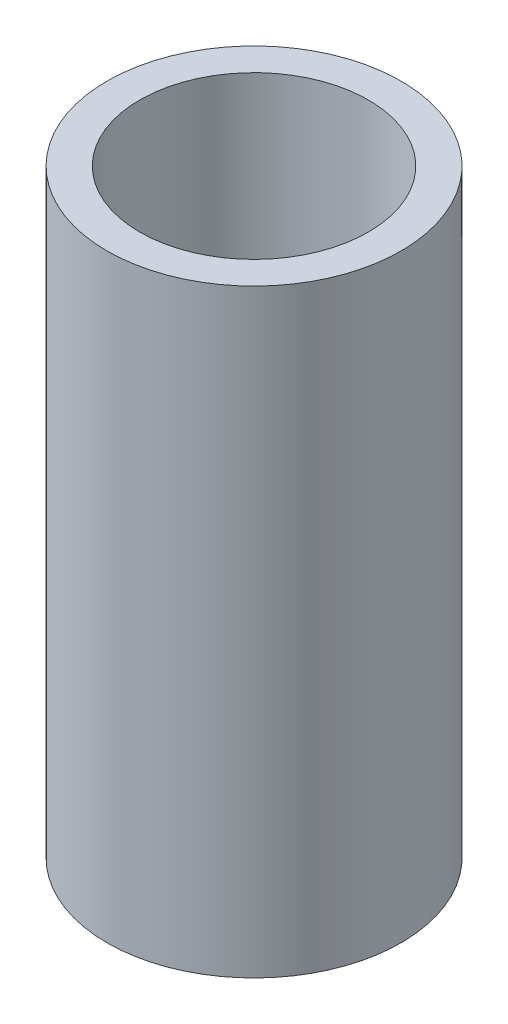
ISO-10303-21;
HEADER;
FILE_DESCRIPTION(('STEP AP214'),'2;1');
FILE_NAME('part.step','',(''),(''),'','','');
FILE_SCHEMA(('AUTOMOTIVE_DESIGN { 1 0 10303 214 1 1 1 1 }'));
ENDSEC;
DATA;
#1=APPLICATION_CONTEXT('core data for automotive mechanical design processes');
#2=APPLICATION_PROTOCOL_DEFINITION('international standard','automotive_design',2000,#1);
#3=PRODUCT_CONTEXT('',#1,'mechanical');
#4=PRODUCT('Part','Part','',(#3));
#5=PRODUCT_RELATED_PRODUCT_CATEGORY('part','',(#4));
#6=PRODUCT_DEFINITION_FORMATION('','',#4);
#7=PRODUCT_DEFINITION_CONTEXT('part definition',#1,'design');
#8=PRODUCT_DEFINITION('design','',#6,#7);
#9=PRODUCT_DEFINITION_SHAPE('','',#8);
#10=(LENGTH_UNIT() NAMED_UNIT(*) SI_UNIT(.MILLI.,.METRE.));
#11=(NAMED_UNIT(*) PLANE_ANGLE_UNIT() SI_UNIT($,.RADIAN.));
#12=(NAMED_UNIT(*) SI_UNIT($,.STERADIAN.) SOLID_ANGLE_UNIT());
#13=UNCERTAINTY_MEASURE_WITH_UNIT(LENGTH_MEASURE(1.E-05),#10,'distance_accuracy_value','');
#14=(GEOMETRIC_REPRESENTATION_CONTEXT(3) GLOBAL_UNCERTAINTY_ASSIGNED_CONTEXT((#13)) GLOBAL_UNIT_ASSIGNED_CONTEXT((#10,
#11,#12)) REPRESENTATION_CONTEXT('',''));
#15=CARTESIAN_POINT('',(0.,0.,0.));
#16=DIRECTION('',(0.,0.,1.));
#17=DIRECTION('',(1.,0.,0.));
#18=AXIS2_PLACEMENT_3D('',#15,#16,#17);
#19=CARTESIAN_POINT('',(0.,13.97,0.));
#20=DIRECTION('',(0.,1.,0.));
#21=DIRECTION('',(0.,0.,1.));
#22=AXIS2_PLACEMENT_3D('',#19,#20,#21);
#23=PLANE('',#22);
#24=CARTESIAN_POINT('',(0.,13.97,0.));
#25=DIRECTION('',(0.,1.,0.));
#26=DIRECTION('',(0.,0.,1.));
#27=AXIS2_PLACEMENT_3D('',#24,#25,#26);
#28=CIRCLE('',#27,3.429);
#29=CARTESIAN_POINT('',(0.,13.97,3.429));
#30=VERTEX_POINT('',#29);
#31=EDGE_CURVE('E10',#30,#30,#28,.T.);
#32=ORIENTED_EDGE('',*,*,#31,.T.);
#33=EDGE_LOOP('',(#32));
#34=FACE_BOUND('',#33,.T.);
#35=CARTESIAN_POINT('',(0.,13.97,0.));
#36=DIRECTION('',(0.,1.,0.));
#37=DIRECTION('',(0.,0.,1.));
#38=AXIS2_PLACEMENT_3D('',#35,#36,#37);
#39=CIRCLE('',#38,2.667);
#40=CARTESIAN_POINT('',(0.,13.97,2.667));
#41=VERTEX_POINT('',#40);
#42=EDGE_CURVE('E46',#41,#41,#39,.T.);
#43=ORIENTED_EDGE('',*,*,#42,.F.);
#44=EDGE_LOOP('',(#43));
#45=FACE_BOUND('',#44,.T.);
#46=ADVANCED_FACE('F35',(#34,#45),#23,.T.);
#47=CARTESIAN_POINT('',(0.,0.,0.));
#48=DIRECTION('',(0.,1.,0.));
#49=DIRECTION('',(0.,0.,1.));
#50=AXIS2_PLACEMENT_3D('',#47,#48,#49);
#51=PLANE('',#50);
#52=CARTESIAN_POINT('',(0.,0.,0.));
#53=DIRECTION('',(0.,1.,0.));
#54=DIRECTION('',(0.,0.,1.));
#55=AXIS2_PLACEMENT_3D('',#52,#53,#54);
#56=CIRCLE('',#55,3.429);
#57=CARTESIAN_POINT('',(0.,0.,3.429));
#58=VERTEX_POINT('',#57);
#59=EDGE_CURVE('E39',#58,#58,#56,.T.);
#60=ORIENTED_EDGE('',*,*,#59,.F.);
#61=EDGE_LOOP('',(#60));
#62=FACE_BOUND('',#61,.T.);
#63=CARTESIAN_POINT('',(0.,0.,0.));
#64=DIRECTION('',(0.,1.,0.));
#65=DIRECTION('',(0.,0.,1.));
#66=AXIS2_PLACEMENT_3D('',#63,#64,#65);
#67=CIRCLE('',#66,2.667);
#68=CARTESIAN_POINT('',(0.,0.,2.667));
#69=VERTEX_POINT('',#68);
#70=EDGE_CURVE('E48',#69,#69,#67,.T.);
#71=ORIENTED_EDGE('',*,*,#70,.T.);
#72=EDGE_LOOP('',(#71));
#73=FACE_BOUND('',#72,.T.);
#74=ADVANCED_FACE('F58',(#62,#73),#51,.F.);
#75=CARTESIAN_POINT('',(0.,13.97,0.));
#76=DIRECTION('',(0.,-1.,0.));
#77=DIRECTION('',(0.,0.,-1.));
#78=AXIS2_PLACEMENT_3D('',#75,#76,#77);
#79=CYLINDRICAL_SURFACE('',#78,3.429);
#80=ORIENTED_EDGE('',*,*,#31,.F.);
#81=EDGE_LOOP('',(#80));
#82=FACE_BOUND('',#81,.T.);
#83=ORIENTED_EDGE('',*,*,#59,.T.);
#84=EDGE_LOOP('',(#83));
#85=FACE_BOUND('',#84,.T.);
#86=ADVANCED_FACE('F37',(#82,#85),#79,.T.);
#87=CARTESIAN_POINT('',(0.,13.97,0.));
#88=DIRECTION('',(0.,-1.,0.));
#89=DIRECTION('',(0.,0.,-1.));
#90=AXIS2_PLACEMENT_3D('',#87,#88,#89);
#91=CYLINDRICAL_SURFACE('',#90,2.667);
#92=ORIENTED_EDGE('',*,*,#42,.T.);
#93=EDGE_LOOP('',(#92));
#94=FACE_BOUND('',#93,.T.);
#95=ORIENTED_EDGE('',*,*,#70,.F.);
#96=EDGE_LOOP('',(#95));
#97=FACE_BOUND('',#96,.T.);
#98=ADVANCED_FACE('F54',(#94,#97),#91,.F.);
#99=CLOSED_SHELL('',(#46,#74,#86,#98));
#100=MANIFOLD_SOLID_BREP('B2',#99);
#101=ADVANCED_BREP_SHAPE_REPRESENTATION('',(#18,#100),#14);
#102=SHAPE_DEFINITION_REPRESENTATION(#9,#101);
ENDSEC;
END-ISO-10303-21;
